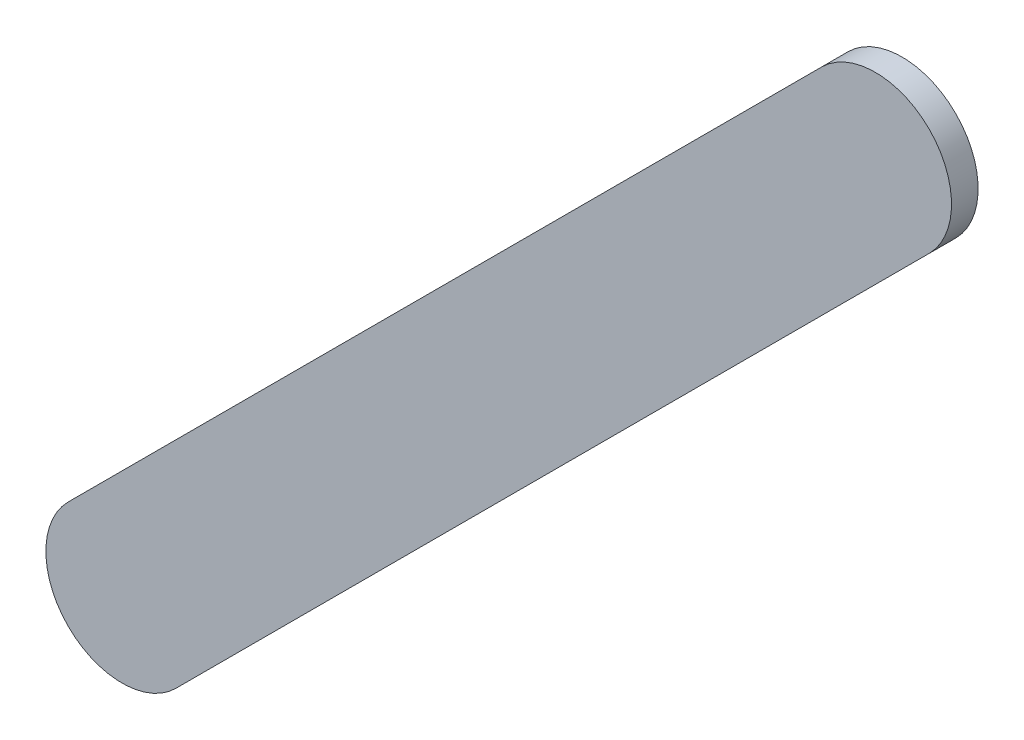
ISO-10303-21;
HEADER;
FILE_DESCRIPTION(('STEP AP214'),'2;1');
FILE_NAME('part.step','',(''),(''),'','','');
FILE_SCHEMA(('AUTOMOTIVE_DESIGN { 1 0 10303 214 1 1 1 1 }'));
ENDSEC;
DATA;
#1=APPLICATION_CONTEXT('core data for automotive mechanical design processes');
#2=APPLICATION_PROTOCOL_DEFINITION('international standard','automotive_design',2000,#1);
#3=PRODUCT_CONTEXT('',#1,'mechanical');
#4=PRODUCT('Part','Part','',(#3));
#5=PRODUCT_RELATED_PRODUCT_CATEGORY('part','',(#4));
#6=PRODUCT_DEFINITION_FORMATION('','',#4);
#7=PRODUCT_DEFINITION_CONTEXT('part definition',#1,'design');
#8=PRODUCT_DEFINITION('design','',#6,#7);
#9=PRODUCT_DEFINITION_SHAPE('','',#8);
#10=(LENGTH_UNIT() NAMED_UNIT(*) SI_UNIT(.MILLI.,.METRE.));
#11=(NAMED_UNIT(*) PLANE_ANGLE_UNIT() SI_UNIT($,.RADIAN.));
#12=(NAMED_UNIT(*) SI_UNIT($,.STERADIAN.) SOLID_ANGLE_UNIT());
#13=UNCERTAINTY_MEASURE_WITH_UNIT(LENGTH_MEASURE(1.E-05),#10,'distance_accuracy_value','');
#14=(GEOMETRIC_REPRESENTATION_CONTEXT(3) GLOBAL_UNCERTAINTY_ASSIGNED_CONTEXT((#13)) GLOBAL_UNIT_ASSIGNED_CONTEXT((#10,
#11,#12)) REPRESENTATION_CONTEXT('',''));
#15=CARTESIAN_POINT('',(0.,0.,0.));
#16=DIRECTION('',(0.,0.,1.));
#17=DIRECTION('',(1.,0.,0.));
#18=AXIS2_PLACEMENT_3D('',#15,#16,#17);
#19=CARTESIAN_POINT('',(107.469289,-102.989289,1.635));
#20=DIRECTION('',(0.,0.,1.));
#21=DIRECTION('',(1.,0.,0.));
#22=AXIS2_PLACEMENT_3D('',#19,#20,#21);
#23=PLANE('',#22);
#24=DIRECTION('',(-0.707106781186548,-0.707106781186548,0.));
#25=VECTOR('',#24,1.);
#26=CARTESIAN_POINT('',(107.469289,-102.989289,1.635));
#27=LINE('',#26,#25);
#28=CARTESIAN_POINT('',(107.469289,-102.989289,1.635));
#29=VERTEX_POINT('',#28);
#30=CARTESIAN_POINT('',(106.479289,-103.979289,1.635));
#31=VERTEX_POINT('',#30);
#32=EDGE_CURVE('E81',#29,#31,#27,.T.);
#33=ORIENTED_EDGE('',*,*,#32,.T.);
#34=CARTESIAN_POINT('',(106.5499995,-104.0499995,1.635));
#35=DIRECTION('',(0.,0.,1.));
#36=DIRECTION('',(-0.707106781186548,0.707106781186548,0.));
#37=AXIS2_PLACEMENT_3D('',#34,#35,#36);
#38=CIRCLE('',#37,0.09999974810219);
#39=CARTESIAN_POINT('',(106.62071,-104.12071,1.635));
#40=VERTEX_POINT('',#39);
#41=EDGE_CURVE('E104',#31,#40,#38,.T.);
#42=ORIENTED_EDGE('',*,*,#41,.T.);
#43=DIRECTION('',(0.707106781186548,0.707106781186548,0.));
#44=VECTOR('',#43,1.);
#45=CARTESIAN_POINT('',(106.62071,-104.12071,1.635));
#46=LINE('',#45,#44);
#47=CARTESIAN_POINT('',(107.61071,-103.13071,1.635));
#48=VERTEX_POINT('',#47);
#49=EDGE_CURVE('E74',#40,#48,#46,.T.);
#50=ORIENTED_EDGE('',*,*,#49,.T.);
#51=CARTESIAN_POINT('',(107.5399995,-103.0599995,1.635));
#52=DIRECTION('',(0.,0.,1.));
#53=DIRECTION('',(0.707106781187048,-0.707106781186048,0.));
#54=AXIS2_PLACEMENT_3D('',#51,#52,#53);
#55=CIRCLE('',#54,0.09999974810218);
#56=EDGE_CURVE('E11',#48,#29,#55,.T.);
#57=ORIENTED_EDGE('',*,*,#56,.T.);
#58=EDGE_LOOP('',(#33,#42,#50,#57));
#59=FACE_BOUND('',#58,.T.);
#60=ADVANCED_FACE('F17',(#59),#23,.T.);
#61=CARTESIAN_POINT('',(107.469289,-102.989289,1.6));
#62=DIRECTION('',(0.,0.,1.));
#63=DIRECTION('',(1.,0.,0.));
#64=AXIS2_PLACEMENT_3D('',#61,#62,#63);
#65=PLANE('',#64);
#66=CARTESIAN_POINT('',(107.5399995,-103.0599995,1.6));
#67=DIRECTION('',(0.,0.,1.));
#68=DIRECTION('',(0.707106781187048,-0.707106781186048,0.));
#69=AXIS2_PLACEMENT_3D('',#66,#67,#68);
#70=CIRCLE('',#69,0.09999974810218);
#71=CARTESIAN_POINT('',(107.61071,-103.13071,1.6));
#72=VERTEX_POINT('',#71);
#73=CARTESIAN_POINT('',(107.469289,-102.989289,1.6));
#74=VERTEX_POINT('',#73);
#75=EDGE_CURVE('E26',#72,#74,#70,.T.);
#76=ORIENTED_EDGE('',*,*,#75,.F.);
#77=DIRECTION('',(0.707106781186548,0.707106781186548,0.));
#78=VECTOR('',#77,1.);
#79=CARTESIAN_POINT('',(106.62071,-104.12071,1.6));
#80=LINE('',#79,#78);
#81=CARTESIAN_POINT('',(106.62071,-104.12071,1.6));
#82=VERTEX_POINT('',#81);
#83=EDGE_CURVE('E107',#82,#72,#80,.T.);
#84=ORIENTED_EDGE('',*,*,#83,.F.);
#85=CARTESIAN_POINT('',(106.5499995,-104.0499995,1.6));
#86=DIRECTION('',(0.,0.,1.));
#87=DIRECTION('',(-0.707106781186548,0.707106781186548,0.));
#88=AXIS2_PLACEMENT_3D('',#85,#86,#87);
#89=CIRCLE('',#88,0.09999974810219);
#90=CARTESIAN_POINT('',(106.479289,-103.979289,1.6));
#91=VERTEX_POINT('',#90);
#92=EDGE_CURVE('E83',#91,#82,#89,.T.);
#93=ORIENTED_EDGE('',*,*,#92,.F.);
#94=DIRECTION('',(-0.707106781186548,-0.707106781186548,0.));
#95=VECTOR('',#94,1.);
#96=CARTESIAN_POINT('',(107.469289,-102.989289,1.6));
#97=LINE('',#96,#95);
#98=EDGE_CURVE('E79',#74,#91,#97,.T.);
#99=ORIENTED_EDGE('',*,*,#98,.F.);
#100=EDGE_LOOP('',(#76,#84,#93,#99));
#101=FACE_BOUND('',#100,.T.);
#102=ADVANCED_FACE('F19',(#101),#65,.F.);
#103=CARTESIAN_POINT('',(107.5399995,-103.0599995,1.6));
#104=DIRECTION('',(0.,0.,-1.));
#105=DIRECTION('',(0.707106781187048,-0.707106781186048,0.));
#106=AXIS2_PLACEMENT_3D('',#103,#104,#105);
#107=CYLINDRICAL_SURFACE('',#106,0.09999974810218);
#108=ORIENTED_EDGE('',*,*,#75,.T.);
#109=DIRECTION('',(0.,0.,1.));
#110=VECTOR('',#109,1.);
#111=CARTESIAN_POINT('',(107.469289,-102.989289,1.6));
#112=LINE('',#111,#110);
#113=EDGE_CURVE('E68',#74,#29,#112,.T.);
#114=ORIENTED_EDGE('',*,*,#113,.T.);
#115=ORIENTED_EDGE('',*,*,#56,.F.);
#116=DIRECTION('',(0.,0.,1.));
#117=VECTOR('',#116,1.);
#118=CARTESIAN_POINT('',(107.61071,-103.13071,1.6));
#119=LINE('',#118,#117);
#120=EDGE_CURVE('E71',#72,#48,#119,.T.);
#121=ORIENTED_EDGE('',*,*,#120,.F.);
#122=EDGE_LOOP('',(#108,#114,#115,#121));
#123=FACE_BOUND('',#122,.T.);
#124=ADVANCED_FACE('F67',(#123),#107,.T.);
#125=CARTESIAN_POINT('',(106.62071,-104.12071,1.6));
#126=DIRECTION('',(-0.707106781186548,0.707106781186548,0.));
#127=DIRECTION('',(0.,0.,1.));
#128=AXIS2_PLACEMENT_3D('',#125,#126,#127);
#129=PLANE('',#128);
#130=ORIENTED_EDGE('',*,*,#83,.T.);
#131=ORIENTED_EDGE('',*,*,#120,.T.);
#132=ORIENTED_EDGE('',*,*,#49,.F.);
#133=DIRECTION('',(0.,0.,1.));
#134=VECTOR('',#133,1.);
#135=CARTESIAN_POINT('',(106.62071,-104.12071,1.6));
#136=LINE('',#135,#134);
#137=EDGE_CURVE('E99',#82,#40,#136,.T.);
#138=ORIENTED_EDGE('',*,*,#137,.F.);
#139=EDGE_LOOP('',(#130,#131,#132,#138));
#140=FACE_BOUND('',#139,.T.);
#141=ADVANCED_FACE('F118',(#140),#129,.F.);
#142=CARTESIAN_POINT('',(106.5499995,-104.0499995,1.6));
#143=DIRECTION('',(0.,0.,-1.));
#144=DIRECTION('',(-0.707106781186548,0.707106781186548,0.));
#145=AXIS2_PLACEMENT_3D('',#142,#143,#144);
#146=CYLINDRICAL_SURFACE('',#145,0.09999974810219);
#147=ORIENTED_EDGE('',*,*,#92,.T.);
#148=ORIENTED_EDGE('',*,*,#137,.T.);
#149=ORIENTED_EDGE('',*,*,#41,.F.);
#150=DIRECTION('',(0.,0.,1.));
#151=VECTOR('',#150,1.);
#152=CARTESIAN_POINT('',(106.479289,-103.979289,1.6));
#153=LINE('',#152,#151);
#154=EDGE_CURVE('E88',#91,#31,#153,.T.);
#155=ORIENTED_EDGE('',*,*,#154,.F.);
#156=EDGE_LOOP('',(#147,#148,#149,#155));
#157=FACE_BOUND('',#156,.T.);
#158=ADVANCED_FACE('F120',(#157),#146,.T.);
#159=CARTESIAN_POINT('',(107.469289,-102.989289,1.6));
#160=DIRECTION('',(0.707106781186548,-0.707106781186548,0.));
#161=DIRECTION('',(0.,0.,-1.));
#162=AXIS2_PLACEMENT_3D('',#159,#160,#161);
#163=PLANE('',#162);
#164=ORIENTED_EDGE('',*,*,#98,.T.);
#165=ORIENTED_EDGE('',*,*,#154,.T.);
#166=ORIENTED_EDGE('',*,*,#32,.F.);
#167=ORIENTED_EDGE('',*,*,#113,.F.);
#168=EDGE_LOOP('',(#164,#165,#166,#167));
#169=FACE_BOUND('',#168,.T.);
#170=ADVANCED_FACE('F77',(#169),#163,.F.);
#171=CLOSED_SHELL('',(#60,#102,#124,#141,#158,#170));
#172=MANIFOLD_SOLID_BREP('B1',#171);
#173=ADVANCED_BREP_SHAPE_REPRESENTATION('',(#18,#172),#14);
#174=SHAPE_DEFINITION_REPRESENTATION(#9,#173);
ENDSEC;
END-ISO-10303-21;
